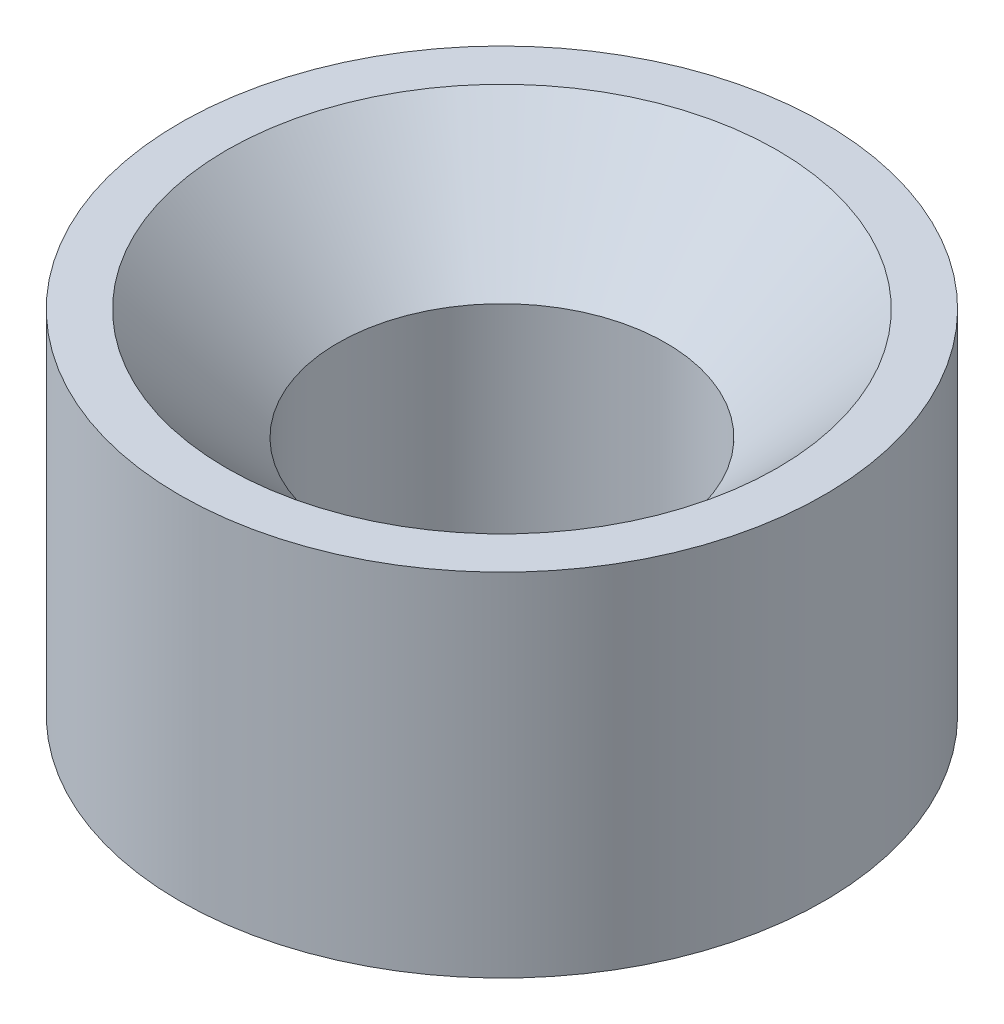
ISO-10303-21;
HEADER;
FILE_DESCRIPTION(('STEP AP214'),'2;1');
FILE_NAME('part.step','',(''),(''),'','','');
FILE_SCHEMA(('AUTOMOTIVE_DESIGN { 1 0 10303 214 1 1 1 1 }'));
ENDSEC;
DATA;
#1=APPLICATION_CONTEXT('core data for automotive mechanical design processes');
#2=APPLICATION_PROTOCOL_DEFINITION('international standard','automotive_design',2000,#1);
#3=PRODUCT_CONTEXT('',#1,'mechanical');
#4=PRODUCT('Part','Part','',(#3));
#5=PRODUCT_RELATED_PRODUCT_CATEGORY('part','',(#4));
#6=PRODUCT_DEFINITION_FORMATION('','',#4);
#7=PRODUCT_DEFINITION_CONTEXT('part definition',#1,'design');
#8=PRODUCT_DEFINITION('design','',#6,#7);
#9=PRODUCT_DEFINITION_SHAPE('','',#8);
#10=(LENGTH_UNIT() NAMED_UNIT(*) SI_UNIT(.MILLI.,.METRE.));
#11=(NAMED_UNIT(*) PLANE_ANGLE_UNIT() SI_UNIT($,.RADIAN.));
#12=(NAMED_UNIT(*) SI_UNIT($,.STERADIAN.) SOLID_ANGLE_UNIT());
#13=UNCERTAINTY_MEASURE_WITH_UNIT(LENGTH_MEASURE(1.E-05),#10,'distance_accuracy_value','');
#14=(GEOMETRIC_REPRESENTATION_CONTEXT(3) GLOBAL_UNCERTAINTY_ASSIGNED_CONTEXT((#13)) GLOBAL_UNIT_ASSIGNED_CONTEXT((#10,
#11,#12)) REPRESENTATION_CONTEXT('',''));
#15=CARTESIAN_POINT('',(0.,0.,0.));
#16=DIRECTION('',(0.,0.,1.));
#17=DIRECTION('',(1.,0.,0.));
#18=AXIS2_PLACEMENT_3D('',#15,#16,#17);
#19=CARTESIAN_POINT('',(0.,1.5,0.));
#20=DIRECTION('',(0.,1.,0.));
#21=DIRECTION('',(0.,0.,1.));
#22=AXIS2_PLACEMENT_3D('',#19,#20,#21);
#23=PLANE('',#22);
#24=CARTESIAN_POINT('',(0.,1.5,0.));
#25=DIRECTION('',(0.,1.,0.));
#26=DIRECTION('',(0.,0.,1.));
#27=AXIS2_PLACEMENT_3D('',#24,#25,#26);
#28=CIRCLE('',#27,2.35);
#29=CARTESIAN_POINT('',(0.,1.5,2.35));
#30=VERTEX_POINT('',#29);
#31=EDGE_CURVE('E10',#30,#30,#28,.F.);
#32=ORIENTED_EDGE('',*,*,#31,.T.);
#33=EDGE_LOOP('',(#32));
#34=FACE_BOUND('',#33,.T.);
#35=CARTESIAN_POINT('',(0.,1.5,0.));
#36=DIRECTION('',(0.,1.,0.));
#37=DIRECTION('',(0.,0.,1.));
#38=AXIS2_PLACEMENT_3D('',#35,#36,#37);
#39=CIRCLE('',#38,2.75);
#40=CARTESIAN_POINT('',(0.,1.5,2.75));
#41=VERTEX_POINT('',#40);
#42=EDGE_CURVE('E44',#41,#41,#39,.T.);
#43=ORIENTED_EDGE('',*,*,#42,.T.);
#44=EDGE_LOOP('',(#43));
#45=FACE_BOUND('',#44,.T.);
#46=ADVANCED_FACE('F32',(#34,#45),#23,.T.);
#47=CARTESIAN_POINT('',(0.,-1.5,0.));
#48=DIRECTION('',(0.,1.,0.));
#49=DIRECTION('',(0.,0.,1.));
#50=AXIS2_PLACEMENT_3D('',#47,#48,#49);
#51=PLANE('',#50);
#52=CARTESIAN_POINT('',(0.,-1.5,0.));
#53=DIRECTION('',(0.,1.,0.));
#54=DIRECTION('',(0.,0.,1.));
#55=AXIS2_PLACEMENT_3D('',#52,#53,#54);
#56=CIRCLE('',#55,2.75);
#57=CARTESIAN_POINT('',(0.,-1.5,2.75));
#58=VERTEX_POINT('',#57);
#59=EDGE_CURVE('E48',#58,#58,#56,.T.);
#60=ORIENTED_EDGE('',*,*,#59,.F.);
#61=EDGE_LOOP('',(#60));
#62=FACE_BOUND('',#61,.T.);
#63=CARTESIAN_POINT('',(0.,-1.5,0.));
#64=DIRECTION('',(0.,1.,0.));
#65=DIRECTION('',(0.,0.,1.));
#66=AXIS2_PLACEMENT_3D('',#63,#64,#65);
#67=CIRCLE('',#66,1.4);
#68=CARTESIAN_POINT('',(0.,-1.5,1.4));
#69=VERTEX_POINT('',#68);
#70=EDGE_CURVE('E52',#69,#69,#67,.T.);
#71=ORIENTED_EDGE('',*,*,#70,.T.);
#72=EDGE_LOOP('',(#71));
#73=FACE_BOUND('',#72,.T.);
#74=ADVANCED_FACE('F57',(#62,#73),#51,.F.);
#75=CARTESIAN_POINT('',(0.,1.5,0.));
#76=DIRECTION('',(0.,-1.,0.));
#77=DIRECTION('',(0.,0.,-1.));
#78=AXIS2_PLACEMENT_3D('',#75,#76,#77);
#79=CYLINDRICAL_SURFACE('',#78,2.75);
#80=ORIENTED_EDGE('',*,*,#42,.F.);
#81=EDGE_LOOP('',(#80));
#82=FACE_BOUND('',#81,.T.);
#83=ORIENTED_EDGE('',*,*,#59,.T.);
#84=EDGE_LOOP('',(#83));
#85=FACE_BOUND('',#84,.T.);
#86=ADVANCED_FACE('F61',(#82,#85),#79,.T.);
#87=CARTESIAN_POINT('',(0.,1.5,0.));
#88=DIRECTION('',(0.,-1.,0.));
#89=DIRECTION('',(0.,0.,-1.));
#90=AXIS2_PLACEMENT_3D('',#87,#88,#89);
#91=CYLINDRICAL_SURFACE('',#90,1.4);
#92=CARTESIAN_POINT('',(0.,0.549999999999998,0.));
#93=DIRECTION('',(0.,1.,0.));
#94=DIRECTION('',(0.,0.,1.));
#95=AXIS2_PLACEMENT_3D('',#92,#93,#94);
#96=CIRCLE('',#95,1.4);
#97=CARTESIAN_POINT('',(0.,0.549999999999998,1.4));
#98=VERTEX_POINT('',#97);
#99=EDGE_CURVE('E40',#98,#98,#96,.T.);
#100=ORIENTED_EDGE('',*,*,#99,.T.);
#101=EDGE_LOOP('',(#100));
#102=FACE_BOUND('',#101,.T.);
#103=ORIENTED_EDGE('',*,*,#70,.F.);
#104=EDGE_LOOP('',(#103));
#105=FACE_BOUND('',#104,.T.);
#106=ADVANCED_FACE('F59',(#102,#105),#91,.F.);
#107=CARTESIAN_POINT('',(0.,0.549999999999998,0.));
#108=DIRECTION('',(0.,1.,0.));
#109=DIRECTION('',(0.,0.,1.));
#110=AXIS2_PLACEMENT_3D('',#107,#108,#109);
#111=CONICAL_SURFACE('',#110,1.4,0.785398163397449);
#112=CARTESIAN_POINT('',(0.,1.5,2.35));
#113=CARTESIAN_POINT('',(0.,1.49010416666667,2.34010416666667));
#114=CARTESIAN_POINT('',(0.,1.48020833333333,2.33020833333334));
#115=CARTESIAN_POINT('',(0.,1.46041666666667,2.31041666666667));
#116=CARTESIAN_POINT('',(0.,1.45052083333333,2.30052083333334));
#117=CARTESIAN_POINT('',(0.,1.43072916666667,2.28072916666667));
#118=CARTESIAN_POINT('',(0.,1.42083333333333,2.27083333333334));
#119=CARTESIAN_POINT('',(0.,1.40104166666667,2.25104166666667));
#120=CARTESIAN_POINT('',(0.,1.39114583333333,2.24114583333334));
#121=CARTESIAN_POINT('',(0.,1.37135416666667,2.22135416666667));
#122=CARTESIAN_POINT('',(0.,1.36145833333333,2.21145833333334));
#123=CARTESIAN_POINT('',(0.,1.34166666666667,2.19166666666667));
#124=CARTESIAN_POINT('',(0.,1.33177083333333,2.18177083333334));
#125=CARTESIAN_POINT('',(0.,1.31197916666667,2.16197916666667));
#126=CARTESIAN_POINT('',(0.,1.30208333333333,2.15208333333334));
#127=CARTESIAN_POINT('',(0.,1.28229166666667,2.13229166666667));
#128=CARTESIAN_POINT('',(0.,1.27239583333333,2.12239583333334));
#129=CARTESIAN_POINT('',(0.,1.25260416666667,2.10260416666667));
#130=CARTESIAN_POINT('',(0.,1.24270833333333,2.09270833333334));
#131=CARTESIAN_POINT('',(0.,1.22291666666667,2.07291666666667));
#132=CARTESIAN_POINT('',(0.,1.21302083333333,2.06302083333334));
#133=CARTESIAN_POINT('',(0.,1.19322916666667,2.04322916666667));
#134=CARTESIAN_POINT('',(0.,1.18333333333333,2.03333333333334));
#135=CARTESIAN_POINT('',(0.,1.16354166666667,2.01354166666667));
#136=CARTESIAN_POINT('',(0.,1.15364583333333,2.00364583333334));
#137=CARTESIAN_POINT('',(0.,1.13385416666667,1.98385416666667));
#138=CARTESIAN_POINT('',(0.,1.12395833333333,1.97395833333334));
#139=CARTESIAN_POINT('',(0.,1.10416666666667,1.95416666666667));
#140=CARTESIAN_POINT('',(0.,1.09427083333333,1.94427083333334));
#141=CARTESIAN_POINT('',(0.,1.07447916666667,1.92447916666667));
#142=CARTESIAN_POINT('',(0.,1.06458333333333,1.91458333333334));
#143=CARTESIAN_POINT('',(0.,1.04479166666667,1.89479166666667));
#144=CARTESIAN_POINT('',(0.,1.03489583333333,1.88489583333334));
#145=CARTESIAN_POINT('',(0.,1.01510416666667,1.86510416666667));
#146=CARTESIAN_POINT('',(0.,1.00520833333333,1.85520833333334));
#147=CARTESIAN_POINT('',(0.,0.985416666666666,1.83541666666667));
#148=CARTESIAN_POINT('',(0.,0.975520833333332,1.82552083333334));
#149=CARTESIAN_POINT('',(0.,0.955729166666666,1.80572916666667));
#150=CARTESIAN_POINT('',(0.,0.945833333333332,1.79583333333333));
#151=CARTESIAN_POINT('',(0.,0.926041666666666,1.77604166666667));
#152=CARTESIAN_POINT('',(0.,0.916145833333332,1.76614583333333));
#153=CARTESIAN_POINT('',(0.,0.896354166666666,1.74635416666667));
#154=CARTESIAN_POINT('',(0.,0.886458333333332,1.73645833333333));
#155=CARTESIAN_POINT('',(0.,0.866666666666666,1.71666666666667));
#156=CARTESIAN_POINT('',(0.,0.856770833333332,1.70677083333333));
#157=CARTESIAN_POINT('',(0.,0.836979166666665,1.68697916666667));
#158=CARTESIAN_POINT('',(0.,0.827083333333332,1.67708333333333));
#159=CARTESIAN_POINT('',(0.,0.807291666666665,1.65729166666667));
#160=CARTESIAN_POINT('',(0.,0.797395833333332,1.64739583333333));
#161=CARTESIAN_POINT('',(0.,0.777604166666665,1.62760416666667));
#162=CARTESIAN_POINT('',(0.,0.767708333333332,1.61770833333333));
#163=CARTESIAN_POINT('',(0.,0.747916666666665,1.59791666666667));
#164=CARTESIAN_POINT('',(0.,0.738020833333332,1.58802083333333));
#165=CARTESIAN_POINT('',(0.,0.718229166666665,1.56822916666667));
#166=CARTESIAN_POINT('',(0.,0.708333333333332,1.55833333333333));
#167=CARTESIAN_POINT('',(0.,0.688541666666665,1.53854166666667));
#168=CARTESIAN_POINT('',(0.,0.678645833333332,1.52864583333333));
#169=CARTESIAN_POINT('',(0.,0.658854166666665,1.50885416666667));
#170=CARTESIAN_POINT('',(0.,0.648958333333332,1.49895833333333));
#171=CARTESIAN_POINT('',(0.,0.629166666666665,1.47916666666667));
#172=CARTESIAN_POINT('',(0.,0.619270833333332,1.46927083333333));
#173=CARTESIAN_POINT('',(0.,0.599479166666665,1.44947916666667));
#174=CARTESIAN_POINT('',(0.,0.589583333333332,1.43958333333333));
#175=CARTESIAN_POINT('',(0.,0.569791666666665,1.41979166666667));
#176=CARTESIAN_POINT('',(0.,0.559895833333331,1.40989583333333));
#177=CARTESIAN_POINT('',(0.,0.549999999999998,1.4));
#178=B_SPLINE_CURVE_WITH_KNOTS('',3,(#112,#113,#114,#115,#116,#117,#118,#119,#120,#121,#122,
#123,#124,#125,#126,#127,#128,#129,#130,#131,#132,#133,#134,#135,#136,#137,#138,#139,#140,#141,
#142,#143,#144,#145,#146,#147,#148,#149,#150,#151,#152,#153,#154,#155,#156,#157,#158,#159,#160,
#161,#162,#163,#164,#165,#166,#167,#168,#169,#170,#171,#172,#173,#174,#175,#176,#177),
.UNSPECIFIED.,.F.,.F.,(4,2,2,2,2,2,2,2,2,2,2,2,2,2,2,2,2,2,2,2,2,2,2,2,2,2,2,2,2,2,2,2,4),(0.,
0.0419844651329515,0.0839689302659029,0.125953395398854,0.167937860531806,0.209922325664757,
0.251906790797708,0.29389125593066,0.335875721063611,0.377860186196562,0.419844651329514,
0.461829116462465,0.503813581595417,0.545798046728368,0.58778251186132,0.629766976994271,
0.671751442127222,0.713735907260174,0.755720372393125,0.797704837526077,0.839689302659028,
0.881673767791979,0.923658232924931,0.965642698057882,1.00762716319083,1.04961162832378,
1.09159609345674,1.13358055858969,1.17556502372264,1.21754948885559,1.25953395398854,
1.30151841912149,1.34350288425444),.UNSPECIFIED.);
#179=EDGE_CURVE('BSEAM35',#30,#98,#178,.T.);
#180=ORIENTED_EDGE('',*,*,#31,.F.);
#181=ORIENTED_EDGE('',*,*,#99,.F.);
#182=ORIENTED_EDGE('',*,*,#179,.T.);
#183=ORIENTED_EDGE('',*,*,#179,.F.);
#184=EDGE_LOOP('',(#180,#182,#181,#183));
#185=FACE_BOUND('',#184,.T.);
#186=ADVANCED_FACE('F35',(#185),#111,.F.);
#187=CLOSED_SHELL('',(#46,#74,#86,#106,#186));
#188=MANIFOLD_SOLID_BREP('B2',#187);
#189=ADVANCED_BREP_SHAPE_REPRESENTATION('',(#18,#188),#14);
#190=SHAPE_DEFINITION_REPRESENTATION(#9,#189);
ENDSEC;
END-ISO-10303-21;
